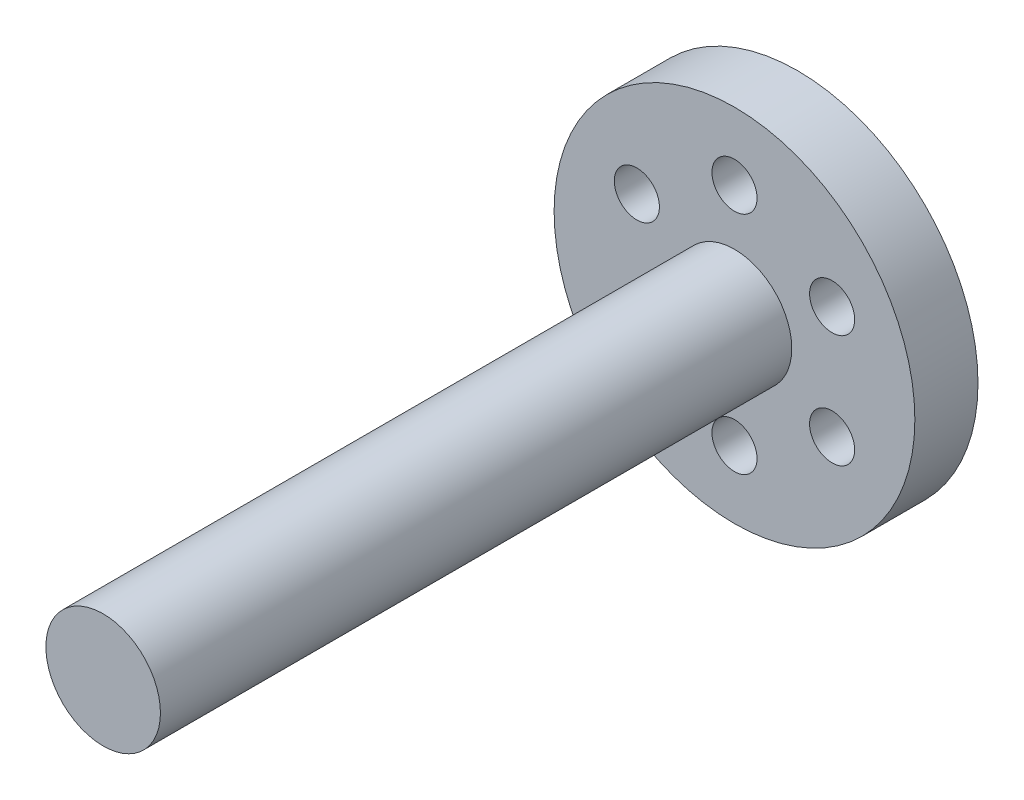
ISO-10303-21;
HEADER;
FILE_DESCRIPTION(('STEP AP214'),'2;1');
FILE_NAME('part.step','',(''),(''),'','','');
FILE_SCHEMA(('AUTOMOTIVE_DESIGN { 1 0 10303 214 1 1 1 1 }'));
ENDSEC;
DATA;
#1=APPLICATION_CONTEXT('core data for automotive mechanical design processes');
#2=APPLICATION_PROTOCOL_DEFINITION('international standard','automotive_design',2000,#1);
#3=PRODUCT_CONTEXT('',#1,'mechanical');
#4=PRODUCT('Part','Part','',(#3));
#5=PRODUCT_RELATED_PRODUCT_CATEGORY('part','',(#4));
#6=PRODUCT_DEFINITION_FORMATION('','',#4);
#7=PRODUCT_DEFINITION_CONTEXT('part definition',#1,'design');
#8=PRODUCT_DEFINITION('design','',#6,#7);
#9=PRODUCT_DEFINITION_SHAPE('','',#8);
#10=(LENGTH_UNIT() NAMED_UNIT(*) SI_UNIT(.MILLI.,.METRE.));
#11=(NAMED_UNIT(*) PLANE_ANGLE_UNIT() SI_UNIT($,.RADIAN.));
#12=(NAMED_UNIT(*) SI_UNIT($,.STERADIAN.) SOLID_ANGLE_UNIT());
#13=UNCERTAINTY_MEASURE_WITH_UNIT(LENGTH_MEASURE(1.E-05),#10,'distance_accuracy_value','');
#14=(GEOMETRIC_REPRESENTATION_CONTEXT(3) GLOBAL_UNCERTAINTY_ASSIGNED_CONTEXT((#13)) GLOBAL_UNIT_ASSIGNED_CONTEXT((#10,
#11,#12)) REPRESENTATION_CONTEXT('',''));
#15=CARTESIAN_POINT('',(0.,0.,0.));
#16=DIRECTION('',(0.,0.,1.));
#17=DIRECTION('',(1.,0.,0.));
#18=AXIS2_PLACEMENT_3D('',#15,#16,#17);
#19=CARTESIAN_POINT('',(0.,0.,7.));
#20=DIRECTION('',(0.,0.,-1.));
#21=DIRECTION('',(-1.,0.,0.));
#22=AXIS2_PLACEMENT_3D('',#19,#20,#21);
#23=CYLINDRICAL_SURFACE('',#22,20.);
#24=CARTESIAN_POINT('',(0.,0.,7.));
#25=DIRECTION('',(0.,0.,1.));
#26=DIRECTION('',(1.,0.,0.));
#27=AXIS2_PLACEMENT_3D('',#24,#25,#26);
#28=CIRCLE('',#27,20.);
#29=CARTESIAN_POINT('',(20.,0.,7.));
#30=VERTEX_POINT('',#29);
#31=EDGE_CURVE('E43',#30,#30,#28,.T.);
#32=ORIENTED_EDGE('',*,*,#31,.F.);
#33=EDGE_LOOP('',(#32));
#34=FACE_BOUND('',#33,.T.);
#35=CARTESIAN_POINT('',(0.,0.,0.));
#36=DIRECTION('',(0.,0.,1.));
#37=DIRECTION('',(1.,0.,0.));
#38=AXIS2_PLACEMENT_3D('',#35,#36,#37);
#39=CIRCLE('',#38,20.);
#40=CARTESIAN_POINT('',(20.,0.,0.));
#41=VERTEX_POINT('',#40);
#42=EDGE_CURVE('E39',#41,#41,#39,.T.);
#43=ORIENTED_EDGE('',*,*,#42,.T.);
#44=EDGE_LOOP('',(#43));
#45=FACE_BOUND('',#44,.T.);
#46=ADVANCED_FACE('F36',(#34,#45),#23,.T.);
#47=CARTESIAN_POINT('',(0.,0.,7.));
#48=DIRECTION('',(0.,0.,1.));
#49=DIRECTION('',(1.,0.,0.));
#50=AXIS2_PLACEMENT_3D('',#47,#48,#49);
#51=PLANE('',#50);
#52=CARTESIAN_POINT('',(0.,0.,7.));
#53=DIRECTION('',(0.,0.,1.));
#54=DIRECTION('',(1.,0.,0.));
#55=AXIS2_PLACEMENT_3D('',#52,#53,#54);
#56=CIRCLE('',#55,6.35);
#57=CARTESIAN_POINT('',(6.35,0.,7.));
#58=VERTEX_POINT('',#57);
#59=EDGE_CURVE('E10',#58,#58,#56,.T.);
#60=ORIENTED_EDGE('',*,*,#59,.F.);
#61=EDGE_LOOP('',(#60));
#62=FACE_BOUND('',#61,.T.);
#63=CARTESIAN_POINT('',(10.8253175473054,6.25000000000013,7.));
#64=DIRECTION('',(0.,0.,1.));
#65=DIRECTION('',(1.,0.,0.));
#66=AXIS2_PLACEMENT_3D('',#63,#64,#65);
#67=CIRCLE('',#66,2.49999999999999);
#68=CARTESIAN_POINT('',(13.3253175473054,6.25000000000013,7.));
#69=VERTEX_POINT('',#68);
#70=EDGE_CURVE('E51',#69,#69,#67,.T.);
#71=ORIENTED_EDGE('',*,*,#70,.F.);
#72=EDGE_LOOP('',(#71));
#73=FACE_BOUND('',#72,.T.);
#74=CARTESIAN_POINT('',(10.8253175473055,-6.2499999999999,7.));
#75=DIRECTION('',(0.,0.,1.));
#76=DIRECTION('',(1.,0.,0.));
#77=AXIS2_PLACEMENT_3D('',#74,#75,#76);
#78=CIRCLE('',#77,2.49999999999999);
#79=CARTESIAN_POINT('',(13.3253175473055,-6.2499999999999,7.));
#80=VERTEX_POINT('',#79);
#81=EDGE_CURVE('E57',#80,#80,#78,.T.);
#82=ORIENTED_EDGE('',*,*,#81,.F.);
#83=EDGE_LOOP('',(#82));
#84=FACE_BOUND('',#83,.T.);
#85=CARTESIAN_POINT('',(0.,-12.5,7.));
#86=DIRECTION('',(0.,0.,1.));
#87=DIRECTION('',(1.,0.,0.));
#88=AXIS2_PLACEMENT_3D('',#85,#86,#87);
#89=CIRCLE('',#88,2.49999999999999);
#90=CARTESIAN_POINT('',(2.49999999999999,-12.5,7.));
#91=VERTEX_POINT('',#90);
#92=EDGE_CURVE('E63',#91,#91,#89,.T.);
#93=ORIENTED_EDGE('',*,*,#92,.F.);
#94=EDGE_LOOP('',(#93));
#95=FACE_BOUND('',#94,.T.);
#96=CARTESIAN_POINT('',(-10.8253175473055,-6.25000000000005,7.));
#97=DIRECTION('',(0.,0.,1.));
#98=DIRECTION('',(1.,0.,0.));
#99=AXIS2_PLACEMENT_3D('',#96,#97,#98);
#100=CIRCLE('',#99,2.49999999999999);
#101=CARTESIAN_POINT('',(-8.32531754730547,-6.25000000000005,7.));
#102=VERTEX_POINT('',#101);
#103=EDGE_CURVE('E69',#102,#102,#100,.T.);
#104=ORIENTED_EDGE('',*,*,#103,.F.);
#105=EDGE_LOOP('',(#104));
#106=FACE_BOUND('',#105,.T.);
#107=CARTESIAN_POINT('',(-10.8253175473055,6.24999999999998,7.));
#108=DIRECTION('',(0.,0.,1.));
#109=DIRECTION('',(1.,0.,0.));
#110=AXIS2_PLACEMENT_3D('',#107,#108,#109);
#111=CIRCLE('',#110,2.49999999999999);
#112=CARTESIAN_POINT('',(-8.32531754730551,6.24999999999998,7.));
#113=VERTEX_POINT('',#112);
#114=EDGE_CURVE('E75',#113,#113,#111,.T.);
#115=ORIENTED_EDGE('',*,*,#114,.F.);
#116=EDGE_LOOP('',(#115));
#117=FACE_BOUND('',#116,.T.);
#118=CARTESIAN_POINT('',(0.,12.5,7.));
#119=DIRECTION('',(0.,0.,1.));
#120=DIRECTION('',(1.,0.,0.));
#121=AXIS2_PLACEMENT_3D('',#118,#119,#120);
#122=CIRCLE('',#121,2.49999999999999);
#123=CARTESIAN_POINT('',(2.49999999999999,12.5,7.));
#124=VERTEX_POINT('',#123);
#125=EDGE_CURVE('E81',#124,#124,#122,.T.);
#126=ORIENTED_EDGE('',*,*,#125,.F.);
#127=EDGE_LOOP('',(#126));
#128=FACE_BOUND('',#127,.T.);
#129=ORIENTED_EDGE('',*,*,#31,.T.);
#130=EDGE_LOOP('',(#129));
#131=FACE_BOUND('',#130,.T.);
#132=ADVANCED_FACE('F95',(#62,#73,#84,#95,#106,#117,#128,#131),#51,.T.);
#133=CARTESIAN_POINT('',(0.,0.,0.));
#134=DIRECTION('',(0.,0.,1.));
#135=DIRECTION('',(1.,0.,0.));
#136=AXIS2_PLACEMENT_3D('',#133,#134,#135);
#137=PLANE('',#136);
#138=CARTESIAN_POINT('',(10.8253175473054,6.25000000000013,0.));
#139=DIRECTION('',(0.,0.,1.));
#140=DIRECTION('',(1.,0.,0.));
#141=AXIS2_PLACEMENT_3D('',#138,#139,#140);
#142=CIRCLE('',#141,2.5);
#143=CARTESIAN_POINT('',(13.3253175473054,6.25000000000013,0.));
#144=VERTEX_POINT('',#143);
#145=EDGE_CURVE('E54',#144,#144,#142,.T.);
#146=ORIENTED_EDGE('',*,*,#145,.T.);
#147=EDGE_LOOP('',(#146));
#148=FACE_BOUND('',#147,.T.);
#149=CARTESIAN_POINT('',(10.8253175473055,-6.2499999999999,0.));
#150=DIRECTION('',(0.,0.,1.));
#151=DIRECTION('',(1.,0.,0.));
#152=AXIS2_PLACEMENT_3D('',#149,#150,#151);
#153=CIRCLE('',#152,2.5);
#154=CARTESIAN_POINT('',(13.3253175473055,-6.2499999999999,0.));
#155=VERTEX_POINT('',#154);
#156=EDGE_CURVE('E60',#155,#155,#153,.T.);
#157=ORIENTED_EDGE('',*,*,#156,.T.);
#158=EDGE_LOOP('',(#157));
#159=FACE_BOUND('',#158,.T.);
#160=CARTESIAN_POINT('',(0.,-12.5,0.));
#161=DIRECTION('',(0.,0.,1.));
#162=DIRECTION('',(1.,0.,0.));
#163=AXIS2_PLACEMENT_3D('',#160,#161,#162);
#164=CIRCLE('',#163,2.5);
#165=CARTESIAN_POINT('',(2.5,-12.5,0.));
#166=VERTEX_POINT('',#165);
#167=EDGE_CURVE('E66',#166,#166,#164,.T.);
#168=ORIENTED_EDGE('',*,*,#167,.T.);
#169=EDGE_LOOP('',(#168));
#170=FACE_BOUND('',#169,.T.);
#171=CARTESIAN_POINT('',(-10.8253175473055,-6.25000000000005,0.));
#172=DIRECTION('',(0.,0.,1.));
#173=DIRECTION('',(1.,0.,0.));
#174=AXIS2_PLACEMENT_3D('',#171,#172,#173);
#175=CIRCLE('',#174,2.5);
#176=CARTESIAN_POINT('',(-8.32531754730546,-6.25000000000005,0.));
#177=VERTEX_POINT('',#176);
#178=EDGE_CURVE('E72',#177,#177,#175,.T.);
#179=ORIENTED_EDGE('',*,*,#178,.T.);
#180=EDGE_LOOP('',(#179));
#181=FACE_BOUND('',#180,.T.);
#182=CARTESIAN_POINT('',(-10.8253175473055,6.24999999999998,0.));
#183=DIRECTION('',(0.,0.,1.));
#184=DIRECTION('',(1.,0.,0.));
#185=AXIS2_PLACEMENT_3D('',#182,#183,#184);
#186=CIRCLE('',#185,2.5);
#187=CARTESIAN_POINT('',(-8.3253175473055,6.24999999999998,0.));
#188=VERTEX_POINT('',#187);
#189=EDGE_CURVE('E78',#188,#188,#186,.T.);
#190=ORIENTED_EDGE('',*,*,#189,.T.);
#191=EDGE_LOOP('',(#190));
#192=FACE_BOUND('',#191,.T.);
#193=CARTESIAN_POINT('',(0.,12.5,0.));
#194=DIRECTION('',(0.,0.,1.));
#195=DIRECTION('',(1.,0.,0.));
#196=AXIS2_PLACEMENT_3D('',#193,#194,#195);
#197=CIRCLE('',#196,2.5);
#198=CARTESIAN_POINT('',(2.5,12.5,0.));
#199=VERTEX_POINT('',#198);
#200=EDGE_CURVE('E84',#199,#199,#197,.T.);
#201=ORIENTED_EDGE('',*,*,#200,.T.);
#202=EDGE_LOOP('',(#201));
#203=FACE_BOUND('',#202,.T.);
#204=ORIENTED_EDGE('',*,*,#42,.F.);
#205=EDGE_LOOP('',(#204));
#206=FACE_BOUND('',#205,.T.);
#207=ADVANCED_FACE('F92',(#148,#159,#170,#181,#192,#203,#206),#137,.F.);
#208=CARTESIAN_POINT('',(0.,12.5,7.));
#209=DIRECTION('',(0.,0.,1.));
#210=DIRECTION('',(1.,0.,0.));
#211=AXIS2_PLACEMENT_3D('',#208,#209,#210);
#212=CYLINDRICAL_SURFACE('',#211,2.49999999999999);
#213=ORIENTED_EDGE('',*,*,#200,.F.);
#214=EDGE_LOOP('',(#213));
#215=FACE_BOUND('',#214,.T.);
#216=ORIENTED_EDGE('',*,*,#125,.T.);
#217=EDGE_LOOP('',(#216));
#218=FACE_BOUND('',#217,.T.);
#219=ADVANCED_FACE('F94',(#215,#218),#212,.F.);
#220=CARTESIAN_POINT('',(-10.8253175473055,6.24999999999998,7.));
#221=DIRECTION('',(0.,0.,1.));
#222=DIRECTION('',(1.,0.,0.));
#223=AXIS2_PLACEMENT_3D('',#220,#221,#222);
#224=CYLINDRICAL_SURFACE('',#223,2.49999999999999);
#225=ORIENTED_EDGE('',*,*,#189,.F.);
#226=EDGE_LOOP('',(#225));
#227=FACE_BOUND('',#226,.T.);
#228=ORIENTED_EDGE('',*,*,#114,.T.);
#229=EDGE_LOOP('',(#228));
#230=FACE_BOUND('',#229,.T.);
#231=ADVANCED_FACE('F101',(#227,#230),#224,.F.);
#232=CARTESIAN_POINT('',(-10.8253175473055,-6.25000000000005,7.));
#233=DIRECTION('',(0.,0.,1.));
#234=DIRECTION('',(1.,0.,0.));
#235=AXIS2_PLACEMENT_3D('',#232,#233,#234);
#236=CYLINDRICAL_SURFACE('',#235,2.49999999999999);
#237=ORIENTED_EDGE('',*,*,#178,.F.);
#238=EDGE_LOOP('',(#237));
#239=FACE_BOUND('',#238,.T.);
#240=ORIENTED_EDGE('',*,*,#103,.T.);
#241=EDGE_LOOP('',(#240));
#242=FACE_BOUND('',#241,.T.);
#243=ADVANCED_FACE('F175',(#239,#242),#236,.F.);
#244=CARTESIAN_POINT('',(0.,-12.5,7.));
#245=DIRECTION('',(0.,0.,1.));
#246=DIRECTION('',(1.,0.,0.));
#247=AXIS2_PLACEMENT_3D('',#244,#245,#246);
#248=CYLINDRICAL_SURFACE('',#247,2.49999999999999);
#249=ORIENTED_EDGE('',*,*,#167,.F.);
#250=EDGE_LOOP('',(#249));
#251=FACE_BOUND('',#250,.T.);
#252=ORIENTED_EDGE('',*,*,#92,.T.);
#253=EDGE_LOOP('',(#252));
#254=FACE_BOUND('',#253,.T.);
#255=ADVANCED_FACE('F166',(#251,#254),#248,.F.);
#256=CARTESIAN_POINT('',(10.8253175473055,-6.2499999999999,7.));
#257=DIRECTION('',(0.,0.,1.));
#258=DIRECTION('',(1.,0.,0.));
#259=AXIS2_PLACEMENT_3D('',#256,#257,#258);
#260=CYLINDRICAL_SURFACE('',#259,2.49999999999999);
#261=ORIENTED_EDGE('',*,*,#156,.F.);
#262=EDGE_LOOP('',(#261));
#263=FACE_BOUND('',#262,.T.);
#264=ORIENTED_EDGE('',*,*,#81,.T.);
#265=EDGE_LOOP('',(#264));
#266=FACE_BOUND('',#265,.T.);
#267=ADVANCED_FACE('F157',(#263,#266),#260,.F.);
#268=CARTESIAN_POINT('',(10.8253175473054,6.25000000000013,7.));
#269=DIRECTION('',(0.,0.,1.));
#270=DIRECTION('',(1.,0.,0.));
#271=AXIS2_PLACEMENT_3D('',#268,#269,#270);
#272=CYLINDRICAL_SURFACE('',#271,2.49999999999999);
#273=ORIENTED_EDGE('',*,*,#145,.F.);
#274=EDGE_LOOP('',(#273));
#275=FACE_BOUND('',#274,.T.);
#276=ORIENTED_EDGE('',*,*,#70,.T.);
#277=EDGE_LOOP('',(#276));
#278=FACE_BOUND('',#277,.T.);
#279=ADVANCED_FACE('F126',(#275,#278),#272,.F.);
#280=CARTESIAN_POINT('',(0.,0.,77.));
#281=DIRECTION('',(0.,0.,-1.));
#282=DIRECTION('',(-1.,0.,0.));
#283=AXIS2_PLACEMENT_3D('',#280,#281,#282);
#284=CYLINDRICAL_SURFACE('',#283,6.35);
#285=CARTESIAN_POINT('',(0.,0.,77.));
#286=DIRECTION('',(0.,0.,1.));
#287=DIRECTION('',(1.,0.,0.));
#288=AXIS2_PLACEMENT_3D('',#285,#286,#287);
#289=CIRCLE('',#288,6.35);
#290=CARTESIAN_POINT('',(6.35,0.,77.));
#291=VERTEX_POINT('',#290);
#292=EDGE_CURVE('E50',#291,#291,#289,.T.);
#293=ORIENTED_EDGE('',*,*,#292,.F.);
#294=EDGE_LOOP('',(#293));
#295=FACE_BOUND('',#294,.T.);
#296=ORIENTED_EDGE('',*,*,#59,.T.);
#297=EDGE_LOOP('',(#296));
#298=FACE_BOUND('',#297,.T.);
#299=ADVANCED_FACE('F131',(#295,#298),#284,.T.);
#300=CARTESIAN_POINT('',(0.,0.,77.));
#301=DIRECTION('',(0.,0.,1.));
#302=DIRECTION('',(1.,0.,0.));
#303=AXIS2_PLACEMENT_3D('',#300,#301,#302);
#304=PLANE('',#303);
#305=ORIENTED_EDGE('',*,*,#292,.T.);
#306=EDGE_LOOP('',(#305));
#307=FACE_BOUND('',#306,.T.);
#308=ADVANCED_FACE('F136',(#307),#304,.T.);
#309=CLOSED_SHELL('',(#46,#132,#207,#219,#231,#243,#255,#267,#279,#299,#308));
#310=MANIFOLD_SOLID_BREP('B2',#309);
#311=ADVANCED_BREP_SHAPE_REPRESENTATION('',(#18,#310),#14);
#312=SHAPE_DEFINITION_REPRESENTATION(#9,#311);
ENDSEC;
END-ISO-10303-21;
